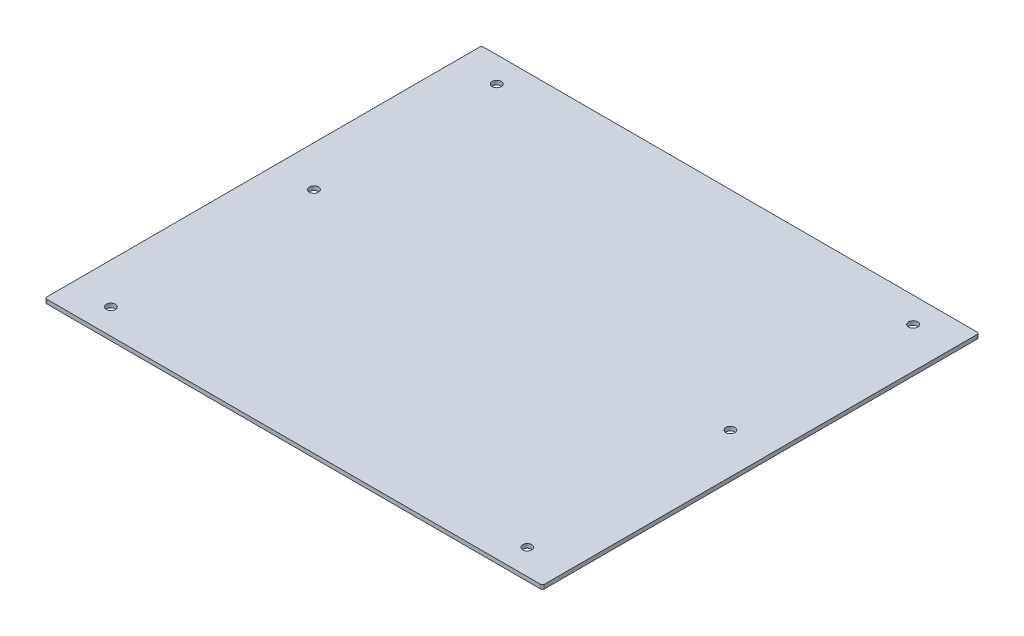
ISO-10303-21;
HEADER;
FILE_DESCRIPTION(('STEP AP214'),'2;1');
FILE_NAME('part.step','',(''),(''),'','','');
FILE_SCHEMA(('AUTOMOTIVE_DESIGN { 1 0 10303 214 1 1 1 1 }'));
ENDSEC;
DATA;
#1=APPLICATION_CONTEXT('core data for automotive mechanical design processes');
#2=APPLICATION_PROTOCOL_DEFINITION('international standard','automotive_design',2000,#1);
#3=PRODUCT_CONTEXT('',#1,'mechanical');
#4=PRODUCT('Part','Part','',(#3));
#5=PRODUCT_RELATED_PRODUCT_CATEGORY('part','',(#4));
#6=PRODUCT_DEFINITION_FORMATION('','',#4);
#7=PRODUCT_DEFINITION_CONTEXT('part definition',#1,'design');
#8=PRODUCT_DEFINITION('design','',#6,#7);
#9=PRODUCT_DEFINITION_SHAPE('','',#8);
#10=(LENGTH_UNIT() NAMED_UNIT(*) SI_UNIT(.MILLI.,.METRE.));
#11=(NAMED_UNIT(*) PLANE_ANGLE_UNIT() SI_UNIT($,.RADIAN.));
#12=(NAMED_UNIT(*) SI_UNIT($,.STERADIAN.) SOLID_ANGLE_UNIT());
#13=UNCERTAINTY_MEASURE_WITH_UNIT(LENGTH_MEASURE(1.E-05),#10,'distance_accuracy_value','');
#14=(GEOMETRIC_REPRESENTATION_CONTEXT(3) GLOBAL_UNCERTAINTY_ASSIGNED_CONTEXT((#13)) GLOBAL_UNIT_ASSIGNED_CONTEXT((#10,
#11,#12)) REPRESENTATION_CONTEXT('',''));
#15=CARTESIAN_POINT('',(0.,0.,0.));
#16=DIRECTION('',(0.,0.,1.));
#17=DIRECTION('',(1.,0.,0.));
#18=AXIS2_PLACEMENT_3D('',#15,#16,#17);
#19=CARTESIAN_POINT('',(122.5,2.,107.5));
#20=DIRECTION('',(0.,1.,0.));
#21=DIRECTION('',(1.,0.,0.));
#22=AXIS2_PLACEMENT_3D('',#19,#20,#21);
#23=PLANE('',#22);
#24=CARTESIAN_POINT('',(225.,2.,202.5));
#25=DIRECTION('',(0.,-1.,0.));
#26=DIRECTION('',(1.,0.,0.));
#27=AXIS2_PLACEMENT_3D('',#24,#25,#26);
#28=CIRCLE('',#27,2.25);
#29=CARTESIAN_POINT('',(222.75,2.,202.5));
#30=VERTEX_POINT('',#29);
#31=EDGE_CURVE('E165',#30,#30,#28,.T.);
#32=ORIENTED_EDGE('',*,*,#31,.T.);
#33=EDGE_LOOP('',(#32));
#34=FACE_BOUND('',#33,.T.);
#35=CARTESIAN_POINT('',(20.,2.,202.5));
#36=DIRECTION('',(0.,-1.,0.));
#37=DIRECTION('',(1.,0.,0.));
#38=AXIS2_PLACEMENT_3D('',#35,#36,#37);
#39=CIRCLE('',#38,2.25);
#40=CARTESIAN_POINT('',(17.75,2.,202.5));
#41=VERTEX_POINT('',#40);
#42=EDGE_CURVE('E228',#41,#41,#39,.T.);
#43=ORIENTED_EDGE('',*,*,#42,.T.);
#44=EDGE_LOOP('',(#43));
#45=FACE_BOUND('',#44,.T.);
#46=CARTESIAN_POINT('',(20.,2.,12.5));
#47=DIRECTION('',(0.,-1.,0.));
#48=DIRECTION('',(1.,0.,0.));
#49=AXIS2_PLACEMENT_3D('',#46,#47,#48);
#50=CIRCLE('',#49,2.25);
#51=CARTESIAN_POINT('',(17.75,2.,12.5));
#52=VERTEX_POINT('',#51);
#53=EDGE_CURVE('E205',#52,#52,#50,.T.);
#54=ORIENTED_EDGE('',*,*,#53,.T.);
#55=EDGE_LOOP('',(#54));
#56=FACE_BOUND('',#55,.T.);
#57=CARTESIAN_POINT('',(225.,2.,12.5));
#58=DIRECTION('',(0.,-1.,0.));
#59=DIRECTION('',(1.,0.,0.));
#60=AXIS2_PLACEMENT_3D('',#57,#58,#59);
#61=CIRCLE('',#60,2.25);
#62=CARTESIAN_POINT('',(222.75,2.,12.5));
#63=VERTEX_POINT('',#62);
#64=EDGE_CURVE('E128',#63,#63,#61,.T.);
#65=ORIENTED_EDGE('',*,*,#64,.T.);
#66=EDGE_LOOP('',(#65));
#67=FACE_BOUND('',#66,.T.);
#68=CARTESIAN_POINT('',(225.,2.,102.5));
#69=DIRECTION('',(0.,-1.,0.));
#70=DIRECTION('',(1.,0.,0.));
#71=AXIS2_PLACEMENT_3D('',#68,#69,#70);
#72=CIRCLE('',#71,2.25);
#73=CARTESIAN_POINT('',(222.75,2.,102.5));
#74=VERTEX_POINT('',#73);
#75=EDGE_CURVE('E101',#74,#74,#72,.T.);
#76=ORIENTED_EDGE('',*,*,#75,.T.);
#77=EDGE_LOOP('',(#76));
#78=FACE_BOUND('',#77,.T.);
#79=CARTESIAN_POINT('',(20.,2.,102.5));
#80=DIRECTION('',(0.,-1.,0.));
#81=DIRECTION('',(1.,0.,0.));
#82=AXIS2_PLACEMENT_3D('',#79,#80,#81);
#83=CIRCLE('',#82,2.25);
#84=CARTESIAN_POINT('',(17.75,2.,102.5));
#85=VERTEX_POINT('',#84);
#86=EDGE_CURVE('E86',#85,#85,#83,.T.);
#87=ORIENTED_EDGE('',*,*,#86,.T.);
#88=EDGE_LOOP('',(#87));
#89=FACE_BOUND('',#88,.T.);
#90=CARTESIAN_POINT('',(1.,2.,1.));
#91=DIRECTION('',(0.,-1.,0.));
#92=DIRECTION('',(-0.707106781186546,0.,-0.707106781186549));
#93=AXIS2_PLACEMENT_3D('',#90,#91,#92);
#94=CIRCLE('',#93,1.);
#95=CARTESIAN_POINT('',(0.,2.,1.));
#96=VERTEX_POINT('',#95);
#97=CARTESIAN_POINT('',(1.,2.,0.));
#98=VERTEX_POINT('',#97);
#99=EDGE_CURVE('E186',#96,#98,#94,.T.);
#100=ORIENTED_EDGE('',*,*,#99,.F.);
#101=DIRECTION('',(0.,0.,1.));
#102=VECTOR('',#101,1.);
#103=CARTESIAN_POINT('',(0.,2.,215.));
#104=LINE('',#103,#102);
#105=CARTESIAN_POINT('',(0.,2.,214.));
#106=VERTEX_POINT('',#105);
#107=EDGE_CURVE('E26',#96,#106,#104,.T.);
#108=ORIENTED_EDGE('',*,*,#107,.T.);
#109=CARTESIAN_POINT('',(1.,2.,214.));
#110=DIRECTION('',(0.,-1.,0.));
#111=DIRECTION('',(-0.707106781186543,0.,0.707106781186553));
#112=AXIS2_PLACEMENT_3D('',#109,#110,#111);
#113=CIRCLE('',#112,1.);
#114=CARTESIAN_POINT('',(1.,2.,215.));
#115=VERTEX_POINT('',#114);
#116=EDGE_CURVE('E151',#115,#106,#113,.T.);
#117=ORIENTED_EDGE('',*,*,#116,.F.);
#118=DIRECTION('',(1.,0.,0.));
#119=VECTOR('',#118,1.);
#120=CARTESIAN_POINT('',(245.,2.,215.));
#121=LINE('',#120,#119);
#122=CARTESIAN_POINT('',(244.,2.,215.));
#123=VERTEX_POINT('',#122);
#124=EDGE_CURVE('E19',#115,#123,#121,.T.);
#125=ORIENTED_EDGE('',*,*,#124,.T.);
#126=CARTESIAN_POINT('',(244.,2.,214.));
#127=DIRECTION('',(0.,-1.,0.));
#128=DIRECTION('',(0.707106781186548,0.,0.707106781186548));
#129=AXIS2_PLACEMENT_3D('',#126,#127,#128);
#130=CIRCLE('',#129,1.);
#131=CARTESIAN_POINT('',(245.,2.,214.));
#132=VERTEX_POINT('',#131);
#133=EDGE_CURVE('E170',#132,#123,#130,.T.);
#134=ORIENTED_EDGE('',*,*,#133,.F.);
#135=DIRECTION('',(0.,0.,-1.));
#136=VECTOR('',#135,1.);
#137=CARTESIAN_POINT('',(245.,2.,0.));
#138=LINE('',#137,#136);
#139=CARTESIAN_POINT('',(245.,2.,1.));
#140=VERTEX_POINT('',#139);
#141=EDGE_CURVE('E10',#132,#140,#138,.T.);
#142=ORIENTED_EDGE('',*,*,#141,.T.);
#143=CARTESIAN_POINT('',(244.,2.,1.));
#144=DIRECTION('',(0.,-1.,0.));
#145=DIRECTION('',(0.707106781186554,0.,-0.707106781186541));
#146=AXIS2_PLACEMENT_3D('',#143,#144,#145);
#147=CIRCLE('',#146,1.);
#148=CARTESIAN_POINT('',(244.,2.,0.));
#149=VERTEX_POINT('',#148);
#150=EDGE_CURVE('E156',#149,#140,#147,.T.);
#151=ORIENTED_EDGE('',*,*,#150,.F.);
#152=DIRECTION('',(-1.,0.,0.));
#153=VECTOR('',#152,1.);
#154=CARTESIAN_POINT('',(0.,2.,0.));
#155=LINE('',#154,#153);
#156=EDGE_CURVE('E146',#149,#98,#155,.T.);
#157=ORIENTED_EDGE('',*,*,#156,.T.);
#158=EDGE_LOOP('',(#100,#108,#117,#125,#134,#142,#151,#157));
#159=FACE_BOUND('',#158,.T.);
#160=ADVANCED_FACE('F15',(#34,#45,#56,#67,#78,#89,#159),#23,.T.);
#161=CARTESIAN_POINT('',(245.,0.,215.));
#162=DIRECTION('',(1.,0.,0.));
#163=DIRECTION('',(0.,1.,0.));
#164=AXIS2_PLACEMENT_3D('',#161,#162,#163);
#165=PLANE('',#164);
#166=DIRECTION('',(0.,-1.,0.));
#167=VECTOR('',#166,1.);
#168=CARTESIAN_POINT('',(245.,0.,1.));
#169=LINE('',#168,#167);
#170=CARTESIAN_POINT('',(245.,0.,1.));
#171=VERTEX_POINT('',#170);
#172=EDGE_CURVE('E164',#140,#171,#169,.T.);
#173=ORIENTED_EDGE('',*,*,#172,.F.);
#174=ORIENTED_EDGE('',*,*,#141,.F.);
#175=DIRECTION('',(0.,1.,0.));
#176=VECTOR('',#175,1.);
#177=CARTESIAN_POINT('',(245.,0.,214.));
#178=LINE('',#177,#176);
#179=CARTESIAN_POINT('',(245.,0.,214.));
#180=VERTEX_POINT('',#179);
#181=EDGE_CURVE('E99',#180,#132,#178,.T.);
#182=ORIENTED_EDGE('',*,*,#181,.F.);
#183=DIRECTION('',(0.,0.,1.));
#184=VECTOR('',#183,1.);
#185=CARTESIAN_POINT('',(245.,0.,0.));
#186=LINE('',#185,#184);
#187=EDGE_CURVE('E111',#171,#180,#186,.T.);
#188=ORIENTED_EDGE('',*,*,#187,.F.);
#189=EDGE_LOOP('',(#173,#174,#182,#188));
#190=FACE_BOUND('',#189,.T.);
#191=ADVANCED_FACE('F332',(#190),#165,.T.);
#192=CARTESIAN_POINT('',(0.,0.,0.));
#193=DIRECTION('',(-1.,0.,0.));
#194=DIRECTION('',(0.,0.,1.));
#195=AXIS2_PLACEMENT_3D('',#192,#193,#194);
#196=PLANE('',#195);
#197=DIRECTION('',(0.,1.,0.));
#198=VECTOR('',#197,1.);
#199=CARTESIAN_POINT('',(0.,0.,1.));
#200=LINE('',#199,#198);
#201=CARTESIAN_POINT('',(0.,0.,1.));
#202=VERTEX_POINT('',#201);
#203=EDGE_CURVE('E118',#202,#96,#200,.T.);
#204=ORIENTED_EDGE('',*,*,#203,.F.);
#205=DIRECTION('',(0.,0.,-1.));
#206=VECTOR('',#205,1.);
#207=CARTESIAN_POINT('',(0.,0.,215.));
#208=LINE('',#207,#206);
#209=CARTESIAN_POINT('',(0.,0.,214.));
#210=VERTEX_POINT('',#209);
#211=EDGE_CURVE('E137',#210,#202,#208,.T.);
#212=ORIENTED_EDGE('',*,*,#211,.F.);
#213=DIRECTION('',(0.,-1.,0.));
#214=VECTOR('',#213,1.);
#215=CARTESIAN_POINT('',(0.,0.,214.));
#216=LINE('',#215,#214);
#217=EDGE_CURVE('E147',#106,#210,#216,.T.);
#218=ORIENTED_EDGE('',*,*,#217,.F.);
#219=ORIENTED_EDGE('',*,*,#107,.F.);
#220=EDGE_LOOP('',(#204,#212,#218,#219));
#221=FACE_BOUND('',#220,.T.);
#222=ADVANCED_FACE('F17',(#221),#196,.T.);
#223=CARTESIAN_POINT('',(20.,0.,102.5));
#224=DIRECTION('',(0.,1.,0.));
#225=DIRECTION('',(1.,0.,0.));
#226=AXIS2_PLACEMENT_3D('',#223,#224,#225);
#227=CYLINDRICAL_SURFACE('',#226,2.25);
#228=ORIENTED_EDGE('',*,*,#86,.F.);
#229=DIRECTION('',(0.,-1.,0.));
#230=VECTOR('',#229,1.);
#231=CARTESIAN_POINT('',(17.75,0.,102.5));
#232=LINE('',#231,#230);
#233=CARTESIAN_POINT('',(17.75,0.,102.5));
#234=VERTEX_POINT('',#233);
#235=EDGE_CURVE('E40',#85,#234,#232,.T.);
#236=ORIENTED_EDGE('',*,*,#235,.T.);
#237=CARTESIAN_POINT('',(20.,0.,102.5));
#238=DIRECTION('',(0.,-1.,0.));
#239=DIRECTION('',(1.,0.,0.));
#240=AXIS2_PLACEMENT_3D('',#237,#238,#239);
#241=CIRCLE('',#240,2.25);
#242=EDGE_CURVE('E85',#234,#234,#241,.T.);
#243=ORIENTED_EDGE('',*,*,#242,.T.);
#244=ORIENTED_EDGE('',*,*,#235,.F.);
#245=EDGE_LOOP('',(#228,#236,#243,#244));
#246=FACE_BOUND('',#245,.T.);
#247=ADVANCED_FACE('F83',(#246),#227,.F.);
#248=CARTESIAN_POINT('',(225.,0.,102.5));
#249=DIRECTION('',(0.,1.,0.));
#250=DIRECTION('',(1.,0.,0.));
#251=AXIS2_PLACEMENT_3D('',#248,#249,#250);
#252=CYLINDRICAL_SURFACE('',#251,2.25);
#253=ORIENTED_EDGE('',*,*,#75,.F.);
#254=DIRECTION('',(0.,-1.,0.));
#255=VECTOR('',#254,1.);
#256=CARTESIAN_POINT('',(222.75,0.,102.5));
#257=LINE('',#256,#255);
#258=CARTESIAN_POINT('',(222.75,0.,102.5));
#259=VERTEX_POINT('',#258);
#260=EDGE_CURVE('E76',#74,#259,#257,.T.);
#261=ORIENTED_EDGE('',*,*,#260,.T.);
#262=CARTESIAN_POINT('',(225.,0.,102.5));
#263=DIRECTION('',(0.,-1.,0.));
#264=DIRECTION('',(1.,0.,0.));
#265=AXIS2_PLACEMENT_3D('',#262,#263,#264);
#266=CIRCLE('',#265,2.25);
#267=EDGE_CURVE('E136',#259,#259,#266,.T.);
#268=ORIENTED_EDGE('',*,*,#267,.T.);
#269=ORIENTED_EDGE('',*,*,#260,.F.);
#270=EDGE_LOOP('',(#253,#261,#268,#269));
#271=FACE_BOUND('',#270,.T.);
#272=ADVANCED_FACE('F340',(#271),#252,.F.);
#273=CARTESIAN_POINT('',(225.,0.,12.5));
#274=DIRECTION('',(0.,1.,0.));
#275=DIRECTION('',(1.,0.,0.));
#276=AXIS2_PLACEMENT_3D('',#273,#274,#275);
#277=CYLINDRICAL_SURFACE('',#276,2.25);
#278=ORIENTED_EDGE('',*,*,#64,.F.);
#279=DIRECTION('',(0.,-1.,0.));
#280=VECTOR('',#279,1.);
#281=CARTESIAN_POINT('',(222.75,0.,12.5));
#282=LINE('',#281,#280);
#283=CARTESIAN_POINT('',(222.75,0.,12.5));
#284=VERTEX_POINT('',#283);
#285=EDGE_CURVE('E105',#63,#284,#282,.T.);
#286=ORIENTED_EDGE('',*,*,#285,.T.);
#287=CARTESIAN_POINT('',(225.,0.,12.5));
#288=DIRECTION('',(0.,-1.,0.));
#289=DIRECTION('',(1.,0.,0.));
#290=AXIS2_PLACEMENT_3D('',#287,#288,#289);
#291=CIRCLE('',#290,2.25);
#292=EDGE_CURVE('E177',#284,#284,#291,.T.);
#293=ORIENTED_EDGE('',*,*,#292,.T.);
#294=ORIENTED_EDGE('',*,*,#285,.F.);
#295=EDGE_LOOP('',(#278,#286,#293,#294));
#296=FACE_BOUND('',#295,.T.);
#297=ADVANCED_FACE('F369',(#296),#277,.F.);
#298=CARTESIAN_POINT('',(20.,0.,12.5));
#299=DIRECTION('',(0.,1.,0.));
#300=DIRECTION('',(1.,0.,0.));
#301=AXIS2_PLACEMENT_3D('',#298,#299,#300);
#302=CYLINDRICAL_SURFACE('',#301,2.25);
#303=ORIENTED_EDGE('',*,*,#53,.F.);
#304=DIRECTION('',(0.,-1.,0.));
#305=VECTOR('',#304,1.);
#306=CARTESIAN_POINT('',(17.75,0.,12.5));
#307=LINE('',#306,#305);
#308=CARTESIAN_POINT('',(17.75,0.,12.5));
#309=VERTEX_POINT('',#308);
#310=EDGE_CURVE('E132',#52,#309,#307,.T.);
#311=ORIENTED_EDGE('',*,*,#310,.T.);
#312=CARTESIAN_POINT('',(20.,0.,12.5));
#313=DIRECTION('',(0.,-1.,0.));
#314=DIRECTION('',(1.,0.,0.));
#315=AXIS2_PLACEMENT_3D('',#312,#313,#314);
#316=CIRCLE('',#315,2.25);
#317=EDGE_CURVE('E117',#309,#309,#316,.T.);
#318=ORIENTED_EDGE('',*,*,#317,.T.);
#319=ORIENTED_EDGE('',*,*,#310,.F.);
#320=EDGE_LOOP('',(#303,#311,#318,#319));
#321=FACE_BOUND('',#320,.T.);
#322=ADVANCED_FACE('F367',(#321),#302,.F.);
#323=CARTESIAN_POINT('',(20.,0.,202.5));
#324=DIRECTION('',(0.,1.,0.));
#325=DIRECTION('',(1.,0.,0.));
#326=AXIS2_PLACEMENT_3D('',#323,#324,#325);
#327=CYLINDRICAL_SURFACE('',#326,2.25);
#328=ORIENTED_EDGE('',*,*,#42,.F.);
#329=DIRECTION('',(0.,-1.,0.));
#330=VECTOR('',#329,1.);
#331=CARTESIAN_POINT('',(17.75,0.,202.5));
#332=LINE('',#331,#330);
#333=CARTESIAN_POINT('',(17.75,0.,202.5));
#334=VERTEX_POINT('',#333);
#335=EDGE_CURVE('E212',#41,#334,#332,.T.);
#336=ORIENTED_EDGE('',*,*,#335,.T.);
#337=CARTESIAN_POINT('',(20.,0.,202.5));
#338=DIRECTION('',(0.,-1.,0.));
#339=DIRECTION('',(1.,0.,0.));
#340=AXIS2_PLACEMENT_3D('',#337,#338,#339);
#341=CIRCLE('',#340,2.25);
#342=EDGE_CURVE('E112',#334,#334,#341,.T.);
#343=ORIENTED_EDGE('',*,*,#342,.T.);
#344=ORIENTED_EDGE('',*,*,#335,.F.);
#345=EDGE_LOOP('',(#328,#336,#343,#344));
#346=FACE_BOUND('',#345,.T.);
#347=ADVANCED_FACE('F327',(#346),#327,.F.);
#348=CARTESIAN_POINT('',(225.,0.,202.5));
#349=DIRECTION('',(0.,1.,0.));
#350=DIRECTION('',(1.,0.,0.));
#351=AXIS2_PLACEMENT_3D('',#348,#349,#350);
#352=CYLINDRICAL_SURFACE('',#351,2.25);
#353=ORIENTED_EDGE('',*,*,#31,.F.);
#354=DIRECTION('',(0.,-1.,0.));
#355=VECTOR('',#354,1.);
#356=CARTESIAN_POINT('',(222.75,0.,202.5));
#357=LINE('',#356,#355);
#358=CARTESIAN_POINT('',(222.75,0.,202.5));
#359=VERTEX_POINT('',#358);
#360=EDGE_CURVE('E168',#30,#359,#357,.T.);
#361=ORIENTED_EDGE('',*,*,#360,.T.);
#362=CARTESIAN_POINT('',(225.,0.,202.5));
#363=DIRECTION('',(0.,-1.,0.));
#364=DIRECTION('',(1.,0.,0.));
#365=AXIS2_PLACEMENT_3D('',#362,#363,#364);
#366=CIRCLE('',#365,2.25);
#367=EDGE_CURVE('E116',#359,#359,#366,.T.);
#368=ORIENTED_EDGE('',*,*,#367,.T.);
#369=ORIENTED_EDGE('',*,*,#360,.F.);
#370=EDGE_LOOP('',(#353,#361,#368,#369));
#371=FACE_BOUND('',#370,.T.);
#372=ADVANCED_FACE('F366',(#371),#352,.F.);
#373=CARTESIAN_POINT('',(244.,0.,214.));
#374=DIRECTION('',(0.,1.,0.));
#375=DIRECTION('',(0.707106781186548,0.,0.707106781186548));
#376=AXIS2_PLACEMENT_3D('',#373,#374,#375);
#377=CYLINDRICAL_SURFACE('',#376,1.);
#378=ORIENTED_EDGE('',*,*,#133,.T.);
#379=DIRECTION('',(0.,-1.,0.));
#380=VECTOR('',#379,1.);
#381=CARTESIAN_POINT('',(244.,0.,215.));
#382=LINE('',#381,#380);
#383=CARTESIAN_POINT('',(244.,0.,215.));
#384=VERTEX_POINT('',#383);
#385=EDGE_CURVE('E225',#123,#384,#382,.T.);
#386=ORIENTED_EDGE('',*,*,#385,.T.);
#387=CARTESIAN_POINT('',(244.,0.,214.));
#388=DIRECTION('',(0.,1.,0.));
#389=DIRECTION('',(0.707106781186548,0.,0.707106781186548));
#390=AXIS2_PLACEMENT_3D('',#387,#388,#389);
#391=CIRCLE('',#390,1.);
#392=EDGE_CURVE('E106',#384,#180,#391,.T.);
#393=ORIENTED_EDGE('',*,*,#392,.T.);
#394=ORIENTED_EDGE('',*,*,#181,.T.);
#395=EDGE_LOOP('',(#378,#386,#393,#394));
#396=FACE_BOUND('',#395,.T.);
#397=ADVANCED_FACE('F283',(#396),#377,.T.);
#398=CARTESIAN_POINT('',(0.,0.,215.));
#399=DIRECTION('',(0.,0.,1.));
#400=DIRECTION('',(1.,0.,0.));
#401=AXIS2_PLACEMENT_3D('',#398,#399,#400);
#402=PLANE('',#401);
#403=DIRECTION('',(0.,1.,0.));
#404=VECTOR('',#403,1.);
#405=CARTESIAN_POINT('',(1.,0.,215.));
#406=LINE('',#405,#404);
#407=CARTESIAN_POINT('',(1.,0.,215.));
#408=VERTEX_POINT('',#407);
#409=EDGE_CURVE('E150',#408,#115,#406,.T.);
#410=ORIENTED_EDGE('',*,*,#409,.F.);
#411=DIRECTION('',(-1.,0.,0.));
#412=VECTOR('',#411,1.);
#413=CARTESIAN_POINT('',(245.,0.,215.));
#414=LINE('',#413,#412);
#415=EDGE_CURVE('E110',#384,#408,#414,.T.);
#416=ORIENTED_EDGE('',*,*,#415,.F.);
#417=ORIENTED_EDGE('',*,*,#385,.F.);
#418=ORIENTED_EDGE('',*,*,#124,.F.);
#419=EDGE_LOOP('',(#410,#416,#417,#418));
#420=FACE_BOUND('',#419,.T.);
#421=ADVANCED_FACE('F278',(#420),#402,.T.);
#422=CARTESIAN_POINT('',(1.,0.,214.));
#423=DIRECTION('',(0.,1.,0.));
#424=DIRECTION('',(-0.707106781186543,0.,0.707106781186553));
#425=AXIS2_PLACEMENT_3D('',#422,#423,#424);
#426=CYLINDRICAL_SURFACE('',#425,1.);
#427=ORIENTED_EDGE('',*,*,#116,.T.);
#428=ORIENTED_EDGE('',*,*,#217,.T.);
#429=CARTESIAN_POINT('',(1.,0.,214.));
#430=DIRECTION('',(0.,1.,0.));
#431=DIRECTION('',(-0.707106781186543,0.,0.707106781186553));
#432=AXIS2_PLACEMENT_3D('',#429,#430,#431);
#433=CIRCLE('',#432,1.);
#434=EDGE_CURVE('E160',#210,#408,#433,.T.);
#435=ORIENTED_EDGE('',*,*,#434,.T.);
#436=ORIENTED_EDGE('',*,*,#409,.T.);
#437=EDGE_LOOP('',(#427,#428,#435,#436));
#438=FACE_BOUND('',#437,.T.);
#439=ADVANCED_FACE('F249',(#438),#426,.T.);
#440=CARTESIAN_POINT('',(244.,0.,1.));
#441=DIRECTION('',(0.,1.,0.));
#442=DIRECTION('',(0.707106781186554,0.,-0.707106781186541));
#443=AXIS2_PLACEMENT_3D('',#440,#441,#442);
#444=CYLINDRICAL_SURFACE('',#443,1.);
#445=ORIENTED_EDGE('',*,*,#150,.T.);
#446=ORIENTED_EDGE('',*,*,#172,.T.);
#447=CARTESIAN_POINT('',(244.,0.,1.));
#448=DIRECTION('',(0.,1.,0.));
#449=DIRECTION('',(0.707106781186554,0.,-0.707106781186541));
#450=AXIS2_PLACEMENT_3D('',#447,#448,#449);
#451=CIRCLE('',#450,1.);
#452=CARTESIAN_POINT('',(244.,0.,0.));
#453=VERTEX_POINT('',#452);
#454=EDGE_CURVE('E139',#171,#453,#451,.T.);
#455=ORIENTED_EDGE('',*,*,#454,.T.);
#456=DIRECTION('',(0.,1.,0.));
#457=VECTOR('',#456,1.);
#458=CARTESIAN_POINT('',(244.,0.,0.));
#459=LINE('',#458,#457);
#460=EDGE_CURVE('E152',#453,#149,#459,.T.);
#461=ORIENTED_EDGE('',*,*,#460,.T.);
#462=EDGE_LOOP('',(#445,#446,#455,#461));
#463=FACE_BOUND('',#462,.T.);
#464=ADVANCED_FACE('F355',(#463),#444,.T.);
#465=CARTESIAN_POINT('',(245.,0.,0.));
#466=DIRECTION('',(0.,0.,-1.));
#467=DIRECTION('',(0.,-1.,0.));
#468=AXIS2_PLACEMENT_3D('',#465,#466,#467);
#469=PLANE('',#468);
#470=DIRECTION('',(0.,-1.,0.));
#471=VECTOR('',#470,1.);
#472=CARTESIAN_POINT('',(1.,0.,0.));
#473=LINE('',#472,#471);
#474=CARTESIAN_POINT('',(1.,0.,0.));
#475=VERTEX_POINT('',#474);
#476=EDGE_CURVE('E127',#98,#475,#473,.T.);
#477=ORIENTED_EDGE('',*,*,#476,.F.);
#478=ORIENTED_EDGE('',*,*,#156,.F.);
#479=ORIENTED_EDGE('',*,*,#460,.F.);
#480=DIRECTION('',(1.,0.,0.));
#481=VECTOR('',#480,1.);
#482=CARTESIAN_POINT('',(0.,0.,0.));
#483=LINE('',#482,#481);
#484=EDGE_CURVE('E122',#475,#453,#483,.T.);
#485=ORIENTED_EDGE('',*,*,#484,.F.);
#486=EDGE_LOOP('',(#477,#478,#479,#485));
#487=FACE_BOUND('',#486,.T.);
#488=ADVANCED_FACE('F346',(#487),#469,.T.);
#489=CARTESIAN_POINT('',(122.5,0.,107.5));
#490=DIRECTION('',(0.,1.,0.));
#491=DIRECTION('',(1.,0.,0.));
#492=AXIS2_PLACEMENT_3D('',#489,#490,#491);
#493=PLANE('',#492);
#494=ORIENTED_EDGE('',*,*,#367,.F.);
#495=EDGE_LOOP('',(#494));
#496=FACE_BOUND('',#495,.T.);
#497=ORIENTED_EDGE('',*,*,#342,.F.);
#498=EDGE_LOOP('',(#497));
#499=FACE_BOUND('',#498,.T.);
#500=ORIENTED_EDGE('',*,*,#317,.F.);
#501=EDGE_LOOP('',(#500));
#502=FACE_BOUND('',#501,.T.);
#503=ORIENTED_EDGE('',*,*,#292,.F.);
#504=EDGE_LOOP('',(#503));
#505=FACE_BOUND('',#504,.T.);
#506=ORIENTED_EDGE('',*,*,#267,.F.);
#507=EDGE_LOOP('',(#506));
#508=FACE_BOUND('',#507,.T.);
#509=ORIENTED_EDGE('',*,*,#242,.F.);
#510=EDGE_LOOP('',(#509));
#511=FACE_BOUND('',#510,.T.);
#512=CARTESIAN_POINT('',(1.,0.,1.));
#513=DIRECTION('',(0.,1.,0.));
#514=DIRECTION('',(-0.707106781186546,0.,-0.707106781186549));
#515=AXIS2_PLACEMENT_3D('',#512,#513,#514);
#516=CIRCLE('',#515,1.);
#517=EDGE_CURVE('E123',#475,#202,#516,.T.);
#518=ORIENTED_EDGE('',*,*,#517,.F.);
#519=ORIENTED_EDGE('',*,*,#484,.T.);
#520=ORIENTED_EDGE('',*,*,#454,.F.);
#521=ORIENTED_EDGE('',*,*,#187,.T.);
#522=ORIENTED_EDGE('',*,*,#392,.F.);
#523=ORIENTED_EDGE('',*,*,#415,.T.);
#524=ORIENTED_EDGE('',*,*,#434,.F.);
#525=ORIENTED_EDGE('',*,*,#211,.T.);
#526=EDGE_LOOP('',(#518,#519,#520,#521,#522,#523,#524,#525));
#527=FACE_BOUND('',#526,.T.);
#528=ADVANCED_FACE('F274',(#496,#499,#502,#505,#508,#511,#527),#493,.F.);
#529=CARTESIAN_POINT('',(1.,0.,1.));
#530=DIRECTION('',(0.,1.,0.));
#531=DIRECTION('',(-0.707106781186546,0.,-0.707106781186549));
#532=AXIS2_PLACEMENT_3D('',#529,#530,#531);
#533=CYLINDRICAL_SURFACE('',#532,1.);
#534=ORIENTED_EDGE('',*,*,#99,.T.);
#535=ORIENTED_EDGE('',*,*,#476,.T.);
#536=ORIENTED_EDGE('',*,*,#517,.T.);
#537=ORIENTED_EDGE('',*,*,#203,.T.);
#538=EDGE_LOOP('',(#534,#535,#536,#537));
#539=FACE_BOUND('',#538,.T.);
#540=ADVANCED_FACE('F345',(#539),#533,.T.);
#541=CLOSED_SHELL('',(#160,#191,#222,#247,#272,#297,#322,#347,#372,#397,#421,#439,#464,#488,
#528,#540));
#542=MANIFOLD_SOLID_BREP('B1',#541);
#543=ADVANCED_BREP_SHAPE_REPRESENTATION('',(#18,#542),#14);
#544=SHAPE_DEFINITION_REPRESENTATION(#9,#543);
ENDSEC;
END-ISO-10303-21;
